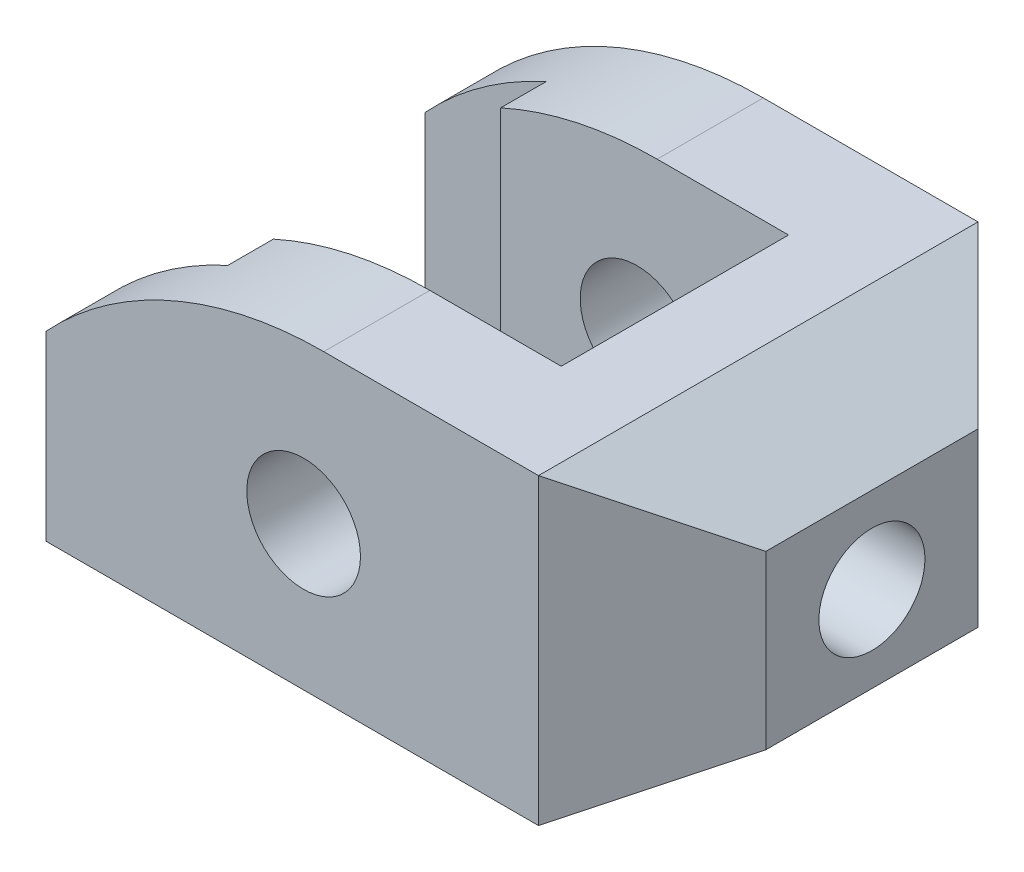
ISO-10303-21;
HEADER;
FILE_DESCRIPTION(('STEP AP214'),'2;1');
FILE_NAME('part.step','',(''),(''),'','','');
FILE_SCHEMA(('AUTOMOTIVE_DESIGN { 1 0 10303 214 1 1 1 1 }'));
ENDSEC;
DATA;
#1=APPLICATION_CONTEXT('core data for automotive mechanical design processes');
#2=APPLICATION_PROTOCOL_DEFINITION('international standard','automotive_design',2000,#1);
#3=PRODUCT_CONTEXT('',#1,'mechanical');
#4=PRODUCT('Part','Part','',(#3));
#5=PRODUCT_RELATED_PRODUCT_CATEGORY('part','',(#4));
#6=PRODUCT_DEFINITION_FORMATION('','',#4);
#7=PRODUCT_DEFINITION_CONTEXT('part definition',#1,'design');
#8=PRODUCT_DEFINITION('design','',#6,#7);
#9=PRODUCT_DEFINITION_SHAPE('','',#8);
#10=(LENGTH_UNIT() NAMED_UNIT(*) SI_UNIT(.MILLI.,.METRE.));
#11=(NAMED_UNIT(*) PLANE_ANGLE_UNIT() SI_UNIT($,.RADIAN.));
#12=(NAMED_UNIT(*) SI_UNIT($,.STERADIAN.) SOLID_ANGLE_UNIT());
#13=UNCERTAINTY_MEASURE_WITH_UNIT(LENGTH_MEASURE(1.E-05),#10,'distance_accuracy_value','');
#14=(GEOMETRIC_REPRESENTATION_CONTEXT(3) GLOBAL_UNCERTAINTY_ASSIGNED_CONTEXT((#13)) GLOBAL_UNIT_ASSIGNED_CONTEXT((#10,
#11,#12)) REPRESENTATION_CONTEXT('',''));
#15=CARTESIAN_POINT('',(0.,0.,0.));
#16=DIRECTION('',(0.,0.,1.));
#17=DIRECTION('',(1.,0.,0.));
#18=AXIS2_PLACEMENT_3D('',#15,#16,#17);
#19=CARTESIAN_POINT('',(-40.,40.,29.));
#20=DIRECTION('',(1.,0.,0.));
#21=DIRECTION('',(0.,0.,-1.));
#22=AXIS2_PLACEMENT_3D('',#19,#20,#21);
#23=PLANE('',#22);
#24=DIRECTION('',(0.,-1.,0.));
#25=VECTOR('',#24,1.);
#26=CARTESIAN_POINT('',(-40.,40.,-21.));
#27=LINE('',#26,#25);
#28=CARTESIAN_POINT('',(-40.,24.,-21.));
#29=VERTEX_POINT('',#28);
#30=CARTESIAN_POINT('',(-40.,0.,-21.));
#31=VERTEX_POINT('',#30);
#32=EDGE_CURVE('E383',#29,#31,#27,.T.);
#33=ORIENTED_EDGE('',*,*,#32,.F.);
#34=DIRECTION('',(0.,0.,1.));
#35=VECTOR('',#34,1.);
#36=CARTESIAN_POINT('',(-40.,24.,-29.));
#37=LINE('',#36,#35);
#38=CARTESIAN_POINT('',(-40.,24.,-29.));
#39=VERTEX_POINT('',#38);
#40=EDGE_CURVE('E356',#39,#29,#37,.T.);
#41=ORIENTED_EDGE('',*,*,#40,.F.);
#42=DIRECTION('',(0.,-1.,0.));
#43=VECTOR('',#42,1.);
#44=CARTESIAN_POINT('',(-40.,40.,-29.));
#45=LINE('',#44,#43);
#46=CARTESIAN_POINT('',(-40.,0.,-29.));
#47=VERTEX_POINT('',#46);
#48=EDGE_CURVE('E222',#39,#47,#45,.T.);
#49=ORIENTED_EDGE('',*,*,#48,.T.);
#50=DIRECTION('',(0.,0.,1.));
#51=VECTOR('',#50,1.);
#52=CARTESIAN_POINT('',(-40.,0.,29.));
#53=LINE('',#52,#51);
#54=EDGE_CURVE('E211',#47,#31,#53,.T.);
#55=ORIENTED_EDGE('',*,*,#54,.T.);
#56=EDGE_LOOP('',(#33,#41,#49,#55));
#57=FACE_BOUND('',#56,.T.);
#58=ADVANCED_FACE('F54',(#57),#23,.F.);
#59=DIRECTION('',(0.,-1.,0.));
#60=VECTOR('',#59,1.);
#61=CARTESIAN_POINT('',(-40.,40.,21.));
#62=LINE('',#61,#60);
#63=CARTESIAN_POINT('',(-40.,24.,21.));
#64=VERTEX_POINT('',#63);
#65=CARTESIAN_POINT('',(-40.,0.,21.));
#66=VERTEX_POINT('',#65);
#67=EDGE_CURVE('E282',#64,#66,#62,.T.);
#68=ORIENTED_EDGE('',*,*,#67,.T.);
#69=CARTESIAN_POINT('',(-40.,0.,29.));
#70=VERTEX_POINT('',#69);
#71=EDGE_CURVE('E218',#66,#70,#53,.T.);
#72=ORIENTED_EDGE('',*,*,#71,.T.);
#73=DIRECTION('',(0.,-1.,0.));
#74=VECTOR('',#73,1.);
#75=CARTESIAN_POINT('',(-40.,40.,29.));
#76=LINE('',#75,#74);
#77=CARTESIAN_POINT('',(-40.,24.,29.));
#78=VERTEX_POINT('',#77);
#79=EDGE_CURVE('E209',#78,#70,#76,.T.);
#80=ORIENTED_EDGE('',*,*,#79,.F.);
#81=EDGE_CURVE('E360',#64,#78,#37,.T.);
#82=ORIENTED_EDGE('',*,*,#81,.F.);
#83=EDGE_LOOP('',(#68,#72,#80,#82));
#84=FACE_BOUND('',#83,.T.);
#85=ADVANCED_FACE('F418',(#84),#23,.F.);
#86=CARTESIAN_POINT('',(40.,40.,29.));
#87=DIRECTION('',(0.,0.,-1.));
#88=DIRECTION('',(-1.,0.,0.));
#89=AXIS2_PLACEMENT_3D('',#86,#87,#88);
#90=PLANE('',#89);
#91=CARTESIAN_POINT('',(-6.00000000000001,19.,29.));
#92=DIRECTION('',(0.,0.,1.));
#93=DIRECTION('',(1.,0.,0.));
#94=AXIS2_PLACEMENT_3D('',#91,#92,#93);
#95=CIRCLE('',#94,7.5);
#96=CARTESIAN_POINT('',(1.49999999999999,19.,29.));
#97=VERTEX_POINT('',#96);
#98=EDGE_CURVE('E190',#97,#97,#95,.T.);
#99=ORIENTED_EDGE('',*,*,#98,.F.);
#100=EDGE_LOOP('',(#99));
#101=FACE_BOUND('',#100,.T.);
#102=DIRECTION('',(0.,-1.,0.));
#103=VECTOR('',#102,1.);
#104=CARTESIAN_POINT('',(25.,40.,29.));
#105=LINE('',#104,#103);
#106=CARTESIAN_POINT('',(25.,40.,29.));
#107=VERTEX_POINT('',#106);
#108=CARTESIAN_POINT('',(25.,0.,29.));
#109=VERTEX_POINT('',#108);
#110=EDGE_CURVE('E167',#107,#109,#105,.T.);
#111=ORIENTED_EDGE('',*,*,#110,.F.);
#112=DIRECTION('',(1.,0.,0.));
#113=VECTOR('',#112,1.);
#114=CARTESIAN_POINT('',(40.,40.,29.));
#115=LINE('',#114,#113);
#116=CARTESIAN_POINT('',(-3.33939444035328,40.,29.));
#117=VERTEX_POINT('',#116);
#118=EDGE_CURVE('E215',#117,#107,#115,.T.);
#119=ORIENTED_EDGE('',*,*,#118,.F.);
#120=CARTESIAN_POINT('',(-3.33939444035329,-10.,29.));
#121=DIRECTION('',(0.,0.,1.));
#122=DIRECTION('',(1.,0.,0.));
#123=AXIS2_PLACEMENT_3D('',#120,#121,#122);
#124=CIRCLE('',#123,50.);
#125=EDGE_CURVE('E337',#117,#78,#124,.T.);
#126=ORIENTED_EDGE('',*,*,#125,.T.);
#127=ORIENTED_EDGE('',*,*,#79,.T.);
#128=DIRECTION('',(1.,0.,0.));
#129=VECTOR('',#128,1.);
#130=CARTESIAN_POINT('',(40.,0.,29.));
#131=LINE('',#130,#129);
#132=EDGE_CURVE('E198',#70,#109,#131,.T.);
#133=ORIENTED_EDGE('',*,*,#132,.T.);
#134=EDGE_LOOP('',(#111,#119,#126,#127,#133));
#135=FACE_BOUND('',#134,.T.);
#136=ADVANCED_FACE('F206',(#101,#135),#90,.F.);
#137=CARTESIAN_POINT('',(40.,40.,29.));
#138=DIRECTION('',(-1.,0.,0.));
#139=DIRECTION('',(0.,0.,1.));
#140=AXIS2_PLACEMENT_3D('',#137,#138,#139);
#141=PLANE('',#140);
#142=CARTESIAN_POINT('',(40.,20.,0.));
#143=DIRECTION('',(1.,0.,0.));
#144=DIRECTION('',(0.,0.,-1.));
#145=AXIS2_PLACEMENT_3D('',#142,#143,#144);
#146=CIRCLE('',#145,7.);
#147=CARTESIAN_POINT('',(40.,20.,-7.));
#148=VERTEX_POINT('',#147);
#149=EDGE_CURVE('E396',#148,#148,#146,.T.);
#150=ORIENTED_EDGE('',*,*,#149,.F.);
#151=EDGE_LOOP('',(#150));
#152=FACE_BOUND('',#151,.T.);
#153=DIRECTION('',(0.,-1.,0.));
#154=VECTOR('',#153,1.);
#155=CARTESIAN_POINT('',(40.,40.,14.0000000000001));
#156=LINE('',#155,#154);
#157=CARTESIAN_POINT('',(40.,31.3397459621557,14.0000000000002));
#158=VERTEX_POINT('',#157);
#159=CARTESIAN_POINT('',(40.,8.66025403784426,14.0000000000001));
#160=VERTEX_POINT('',#159);
#161=EDGE_CURVE('E78',#158,#160,#156,.T.);
#162=ORIENTED_EDGE('',*,*,#161,.T.);
#163=DIRECTION('',(0.,0.,1.));
#164=VECTOR('',#163,1.);
#165=CARTESIAN_POINT('',(40.,8.66025403784426,-29.));
#166=LINE('',#165,#164);
#167=CARTESIAN_POINT('',(40.,8.66025403784425,-14.0000000000002));
#168=VERTEX_POINT('',#167);
#169=EDGE_CURVE('E188',#168,#160,#166,.T.);
#170=ORIENTED_EDGE('',*,*,#169,.F.);
#171=DIRECTION('',(0.,-1.,0.));
#172=VECTOR('',#171,1.);
#173=CARTESIAN_POINT('',(40.,40.,-14.0000000000002));
#174=LINE('',#173,#172);
#175=CARTESIAN_POINT('',(40.,31.3397459621557,-14.0000000000002));
#176=VERTEX_POINT('',#175);
#177=EDGE_CURVE('E234',#176,#168,#174,.T.);
#178=ORIENTED_EDGE('',*,*,#177,.F.);
#179=DIRECTION('',(0.,0.,1.));
#180=VECTOR('',#179,1.);
#181=CARTESIAN_POINT('',(40.,31.3397459621557,-29.));
#182=LINE('',#181,#180);
#183=EDGE_CURVE('E203',#176,#158,#182,.T.);
#184=ORIENTED_EDGE('',*,*,#183,.T.);
#185=EDGE_LOOP('',(#162,#170,#178,#184));
#186=FACE_BOUND('',#185,.T.);
#187=ADVANCED_FACE('F446',(#152,#186),#141,.F.);
#188=CARTESIAN_POINT('',(40.,40.,-29.));
#189=DIRECTION('',(0.,0.,1.));
#190=DIRECTION('',(1.,0.,0.));
#191=AXIS2_PLACEMENT_3D('',#188,#189,#190);
#192=PLANE('',#191);
#193=CARTESIAN_POINT('',(-6.00000000000001,19.,-29.));
#194=DIRECTION('',(0.,0.,1.));
#195=DIRECTION('',(1.,0.,0.));
#196=AXIS2_PLACEMENT_3D('',#193,#194,#195);
#197=CIRCLE('',#196,7.5);
#198=CARTESIAN_POINT('',(1.49999999999999,19.,-29.));
#199=VERTEX_POINT('',#198);
#200=EDGE_CURVE('E343',#199,#199,#197,.T.);
#201=ORIENTED_EDGE('',*,*,#200,.T.);
#202=EDGE_LOOP('',(#201));
#203=FACE_BOUND('',#202,.T.);
#204=DIRECTION('',(0.,-1.,0.));
#205=VECTOR('',#204,1.);
#206=CARTESIAN_POINT('',(25.,40.,-29.));
#207=LINE('',#206,#205);
#208=CARTESIAN_POINT('',(25.,40.,-29.));
#209=VERTEX_POINT('',#208);
#210=CARTESIAN_POINT('',(25.,0.,-29.));
#211=VERTEX_POINT('',#210);
#212=EDGE_CURVE('E177',#209,#211,#207,.T.);
#213=ORIENTED_EDGE('',*,*,#212,.T.);
#214=DIRECTION('',(-1.,0.,0.));
#215=VECTOR('',#214,1.);
#216=CARTESIAN_POINT('',(40.,0.,-29.));
#217=LINE('',#216,#215);
#218=EDGE_CURVE('E201',#211,#47,#217,.T.);
#219=ORIENTED_EDGE('',*,*,#218,.T.);
#220=ORIENTED_EDGE('',*,*,#48,.F.);
#221=CARTESIAN_POINT('',(-3.33939444035329,-10.,-29.));
#222=DIRECTION('',(0.,0.,1.));
#223=DIRECTION('',(1.,0.,0.));
#224=AXIS2_PLACEMENT_3D('',#221,#222,#223);
#225=CIRCLE('',#224,50.);
#226=CARTESIAN_POINT('',(-3.33939444035329,40.,-29.));
#227=VERTEX_POINT('',#226);
#228=EDGE_CURVE('E350',#227,#39,#225,.T.);
#229=ORIENTED_EDGE('',*,*,#228,.F.);
#230=DIRECTION('',(-1.,0.,0.));
#231=VECTOR('',#230,1.);
#232=CARTESIAN_POINT('',(40.,40.,-29.));
#233=LINE('',#232,#231);
#234=EDGE_CURVE('E225',#209,#227,#233,.T.);
#235=ORIENTED_EDGE('',*,*,#234,.F.);
#236=EDGE_LOOP('',(#213,#219,#220,#229,#235));
#237=FACE_BOUND('',#236,.T.);
#238=ADVANCED_FACE('F376',(#203,#237),#192,.F.);
#239=CARTESIAN_POINT('',(0.,40.,0.));
#240=DIRECTION('',(0.,1.,0.));
#241=DIRECTION('',(0.,0.,1.));
#242=AXIS2_PLACEMENT_3D('',#239,#240,#241);
#243=PLANE('',#242);
#244=DIRECTION('',(0.,0.,-1.));
#245=VECTOR('',#244,1.);
#246=CARTESIAN_POINT('',(14.,40.,-15.));
#247=LINE('',#246,#245);
#248=CARTESIAN_POINT('',(14.,40.,15.));
#249=VERTEX_POINT('',#248);
#250=CARTESIAN_POINT('',(14.,40.,-15.));
#251=VERTEX_POINT('',#250);
#252=EDGE_CURVE('E318',#249,#251,#247,.T.);
#253=ORIENTED_EDGE('',*,*,#252,.F.);
#254=DIRECTION('',(1.,0.,0.));
#255=VECTOR('',#254,1.);
#256=CARTESIAN_POINT('',(-24.,40.,15.));
#257=LINE('',#256,#255);
#258=CARTESIAN_POINT('',(-3.33939444035329,40.,15.));
#259=VERTEX_POINT('',#258);
#260=EDGE_CURVE('E296',#259,#249,#257,.T.);
#261=ORIENTED_EDGE('',*,*,#260,.F.);
#262=DIRECTION('',(0.,0.,1.));
#263=VECTOR('',#262,1.);
#264=CARTESIAN_POINT('',(-3.33939444035329,40.,-29.));
#265=LINE('',#264,#263);
#266=EDGE_CURVE('E353',#259,#117,#265,.T.);
#267=ORIENTED_EDGE('',*,*,#266,.T.);
#268=ORIENTED_EDGE('',*,*,#118,.T.);
#269=DIRECTION('',(0.,0.,1.));
#270=VECTOR('',#269,1.);
#271=CARTESIAN_POINT('',(25.,40.,-29.));
#272=LINE('',#271,#270);
#273=EDGE_CURVE('E334',#209,#107,#272,.T.);
#274=ORIENTED_EDGE('',*,*,#273,.F.);
#275=ORIENTED_EDGE('',*,*,#234,.T.);
#276=CARTESIAN_POINT('',(-3.33939444035329,40.,-15.));
#277=VERTEX_POINT('',#276);
#278=EDGE_CURVE('E361',#227,#277,#265,.T.);
#279=ORIENTED_EDGE('',*,*,#278,.T.);
#280=DIRECTION('',(-1.,0.,0.));
#281=VECTOR('',#280,1.);
#282=CARTESIAN_POINT('',(-24.,40.,-15.));
#283=LINE('',#282,#281);
#284=EDGE_CURVE('E70',#251,#277,#283,.T.);
#285=ORIENTED_EDGE('',*,*,#284,.F.);
#286=EDGE_LOOP('',(#253,#261,#267,#268,#274,#275,#279,#285));
#287=FACE_BOUND('',#286,.T.);
#288=ADVANCED_FACE('F373',(#287),#243,.T.);
#289=CARTESIAN_POINT('',(0.,0.,0.));
#290=DIRECTION('',(0.,1.,0.));
#291=DIRECTION('',(0.,0.,1.));
#292=AXIS2_PLACEMENT_3D('',#289,#290,#291);
#293=PLANE('',#292);
#294=DIRECTION('',(-1.,0.,0.));
#295=VECTOR('',#294,1.);
#296=CARTESIAN_POINT('',(-40.,0.,-21.));
#297=LINE('',#296,#295);
#298=CARTESIAN_POINT('',(-24.,0.,-21.));
#299=VERTEX_POINT('',#298);
#300=EDGE_CURVE('E309',#299,#31,#297,.T.);
#301=ORIENTED_EDGE('',*,*,#300,.T.);
#302=ORIENTED_EDGE('',*,*,#54,.F.);
#303=ORIENTED_EDGE('',*,*,#218,.F.);
#304=DIRECTION('',(0.,0.,1.));
#305=VECTOR('',#304,1.);
#306=CARTESIAN_POINT('',(25.,0.,-29.));
#307=LINE('',#306,#305);
#308=EDGE_CURVE('E185',#211,#109,#307,.T.);
#309=ORIENTED_EDGE('',*,*,#308,.T.);
#310=ORIENTED_EDGE('',*,*,#132,.F.);
#311=ORIENTED_EDGE('',*,*,#71,.F.);
#312=DIRECTION('',(1.,0.,0.));
#313=VECTOR('',#312,1.);
#314=CARTESIAN_POINT('',(-40.,0.,21.));
#315=LINE('',#314,#313);
#316=CARTESIAN_POINT('',(-24.,0.,21.));
#317=VERTEX_POINT('',#316);
#318=EDGE_CURVE('E305',#66,#317,#315,.T.);
#319=ORIENTED_EDGE('',*,*,#318,.T.);
#320=DIRECTION('',(0.,0.,-1.));
#321=VECTOR('',#320,1.);
#322=CARTESIAN_POINT('',(-24.,0.,21.));
#323=LINE('',#322,#321);
#324=CARTESIAN_POINT('',(-24.,0.,15.));
#325=VERTEX_POINT('',#324);
#326=EDGE_CURVE('E302',#317,#325,#323,.T.);
#327=ORIENTED_EDGE('',*,*,#326,.T.);
#328=DIRECTION('',(1.,0.,0.));
#329=VECTOR('',#328,1.);
#330=CARTESIAN_POINT('',(-24.,0.,15.));
#331=LINE('',#330,#329);
#332=CARTESIAN_POINT('',(14.,0.,15.));
#333=VERTEX_POINT('',#332);
#334=EDGE_CURVE('E273',#325,#333,#331,.T.);
#335=ORIENTED_EDGE('',*,*,#334,.T.);
#336=DIRECTION('',(0.,0.,-1.));
#337=VECTOR('',#336,1.);
#338=CARTESIAN_POINT('',(14.,0.,-15.));
#339=LINE('',#338,#337);
#340=CARTESIAN_POINT('',(14.,0.,-15.));
#341=VERTEX_POINT('',#340);
#342=EDGE_CURVE('E295',#333,#341,#339,.T.);
#343=ORIENTED_EDGE('',*,*,#342,.T.);
#344=DIRECTION('',(-1.,0.,0.));
#345=VECTOR('',#344,1.);
#346=CARTESIAN_POINT('',(-24.,0.,-15.));
#347=LINE('',#346,#345);
#348=CARTESIAN_POINT('',(-24.,0.,-15.));
#349=VERTEX_POINT('',#348);
#350=EDGE_CURVE('E291',#341,#349,#347,.T.);
#351=ORIENTED_EDGE('',*,*,#350,.T.);
#352=DIRECTION('',(0.,0.,-1.));
#353=VECTOR('',#352,1.);
#354=CARTESIAN_POINT('',(-24.,0.,-21.));
#355=LINE('',#354,#353);
#356=EDGE_CURVE('E312',#349,#299,#355,.T.);
#357=ORIENTED_EDGE('',*,*,#356,.T.);
#358=EDGE_LOOP('',(#301,#302,#303,#309,#310,#311,#319,#327,#335,#343,#351,#357));
#359=FACE_BOUND('',#358,.T.);
#360=ADVANCED_FACE('F196',(#359),#293,.F.);
#361=CARTESIAN_POINT('',(6.24999999999986,-10.8253175473054,-29.));
#362=DIRECTION('',(-0.499999999999995,0.866025403784442,0.));
#363=DIRECTION('',(-0.866025403784442,-0.499999999999994,0.));
#364=AXIS2_PLACEMENT_3D('',#361,#362,#363);
#365=PLANE('',#364);
#366=DIRECTION('',(0.654653670707981,0.377964473009224,-0.654653670707975));
#367=VECTOR('',#366,1.);
#368=CARTESIAN_POINT('',(39.1428571428571,8.16538237853884,14.8571428571431));
#369=LINE('',#368,#367);
#370=EDGE_CURVE('E170',#109,#160,#369,.T.);
#371=ORIENTED_EDGE('',*,*,#370,.F.);
#372=ORIENTED_EDGE('',*,*,#308,.F.);
#373=DIRECTION('',(-0.654653670707982,-0.377964473009224,-0.654653670707974));
#374=VECTOR('',#373,1.);
#375=CARTESIAN_POINT('',(14.2857142857141,-6.18589574131741,-39.7142857142857));
#376=LINE('',#375,#374);
#377=EDGE_CURVE('E191',#168,#211,#376,.T.);
#378=ORIENTED_EDGE('',*,*,#377,.F.);
#379=ORIENTED_EDGE('',*,*,#169,.T.);
#380=EDGE_LOOP('',(#371,#372,#378,#379));
#381=FACE_BOUND('',#380,.T.);
#382=ADVANCED_FACE('F183',(#381),#365,.F.);
#383=CARTESIAN_POINT('',(-3.33939444035329,-10.,-29.));
#384=DIRECTION('',(0.,0.,1.));
#385=DIRECTION('',(1.,0.,0.));
#386=AXIS2_PLACEMENT_3D('',#383,#384,#385);
#387=CYLINDRICAL_SURFACE('',#386,50.);
#388=DIRECTION('',(0.,0.,1.));
#389=VECTOR('',#388,1.);
#390=CARTESIAN_POINT('',(-24.,35.5317403347236,-29.));
#391=LINE('',#390,#389);
#392=CARTESIAN_POINT('',(-24.,35.5317403347236,15.));
#393=VERTEX_POINT('',#392);
#394=CARTESIAN_POINT('',(-24.,35.5317403347236,21.));
#395=VERTEX_POINT('',#394);
#396=EDGE_CURVE('E63',#393,#395,#391,.T.);
#397=ORIENTED_EDGE('',*,*,#396,.T.);
#398=CARTESIAN_POINT('',(-3.33939444035329,-10.,21.));
#399=DIRECTION('',(0.,0.,-1.));
#400=DIRECTION('',(-1.,0.,0.));
#401=AXIS2_PLACEMENT_3D('',#398,#399,#400);
#402=CIRCLE('',#401,50.);
#403=EDGE_CURVE('E12',#395,#64,#402,.F.);
#404=ORIENTED_EDGE('',*,*,#403,.T.);
#405=ORIENTED_EDGE('',*,*,#81,.T.);
#406=ORIENTED_EDGE('',*,*,#125,.F.);
#407=ORIENTED_EDGE('',*,*,#266,.F.);
#408=CARTESIAN_POINT('',(-3.33939444035329,-10.,15.));
#409=DIRECTION('',(0.,0.,-1.));
#410=DIRECTION('',(-1.,0.,0.));
#411=AXIS2_PLACEMENT_3D('',#408,#409,#410);
#412=CIRCLE('',#411,50.);
#413=EDGE_CURVE('E239',#259,#393,#412,.F.);
#414=ORIENTED_EDGE('',*,*,#413,.T.);
#415=EDGE_LOOP('',(#397,#404,#405,#406,#407,#414));
#416=FACE_BOUND('',#415,.T.);
#417=ADVANCED_FACE('F257',(#416),#387,.T.);
#418=ORIENTED_EDGE('',*,*,#40,.T.);
#419=CARTESIAN_POINT('',(-3.33939444035329,-10.,-21.));
#420=DIRECTION('',(0.,0.,1.));
#421=DIRECTION('',(1.,0.,0.));
#422=AXIS2_PLACEMENT_3D('',#419,#420,#421);
#423=CIRCLE('',#422,50.);
#424=CARTESIAN_POINT('',(-24.,35.5317403347236,-21.));
#425=VERTEX_POINT('',#424);
#426=EDGE_CURVE('E249',#29,#425,#423,.F.);
#427=ORIENTED_EDGE('',*,*,#426,.T.);
#428=DIRECTION('',(0.,0.,1.));
#429=VECTOR('',#428,1.);
#430=CARTESIAN_POINT('',(-24.,35.5317403347236,-29.));
#431=LINE('',#430,#429);
#432=CARTESIAN_POINT('',(-24.,35.5317403347236,-15.));
#433=VERTEX_POINT('',#432);
#434=EDGE_CURVE('E245',#425,#433,#431,.T.);
#435=ORIENTED_EDGE('',*,*,#434,.T.);
#436=CARTESIAN_POINT('',(-3.33939444035329,-10.,-15.));
#437=DIRECTION('',(0.,0.,1.));
#438=DIRECTION('',(1.,0.,0.));
#439=AXIS2_PLACEMENT_3D('',#436,#437,#438);
#440=CIRCLE('',#439,50.);
#441=EDGE_CURVE('E233',#433,#277,#440,.F.);
#442=ORIENTED_EDGE('',*,*,#441,.T.);
#443=ORIENTED_EDGE('',*,*,#278,.F.);
#444=ORIENTED_EDGE('',*,*,#228,.T.);
#445=EDGE_LOOP('',(#418,#427,#435,#442,#443,#444));
#446=FACE_BOUND('',#445,.T.);
#447=ADVANCED_FACE('F380',(#446),#387,.T.);
#448=CARTESIAN_POINT('',(23.5705080756885,40.8253175473056,-29.));
#449=DIRECTION('',(0.499999999999995,0.866025403784442,0.));
#450=DIRECTION('',(-0.866025403784442,0.499999999999995,0.));
#451=AXIS2_PLACEMENT_3D('',#448,#449,#450);
#452=PLANE('',#451);
#453=ORIENTED_EDGE('',*,*,#273,.T.);
#454=DIRECTION('',(0.654653670707981,-0.377964473009224,-0.654653670707975));
#455=VECTOR('',#454,1.);
#456=CARTESIAN_POINT('',(49.0402903289649,26.1203319071755,4.95970967103531));
#457=LINE('',#456,#455);
#458=EDGE_CURVE('E171',#107,#158,#457,.T.);
#459=ORIENTED_EDGE('',*,*,#458,.T.);
#460=ORIENTED_EDGE('',*,*,#183,.F.);
#461=DIRECTION('',(-0.654653670707981,0.377964473009225,-0.654653670707974));
#462=VECTOR('',#461,1.);
#463=CARTESIAN_POINT('',(24.183147471822,40.4716100270318,-29.816852528178));
#464=LINE('',#463,#462);
#465=EDGE_CURVE('E228',#176,#209,#464,.T.);
#466=ORIENTED_EDGE('',*,*,#465,.T.);
#467=EDGE_LOOP('',(#453,#459,#460,#466));
#468=FACE_BOUND('',#467,.T.);
#469=ADVANCED_FACE('F468',(#468),#452,.T.);
#470=CARTESIAN_POINT('',(-6.00000000000001,19.,-29.));
#471=DIRECTION('',(0.,0.,1.));
#472=DIRECTION('',(1.,0.,0.));
#473=AXIS2_PLACEMENT_3D('',#470,#471,#472);
#474=CYLINDRICAL_SURFACE('',#473,7.5);
#475=ORIENTED_EDGE('',*,*,#98,.T.);
#476=EDGE_LOOP('',(#475));
#477=FACE_BOUND('',#476,.T.);
#478=CARTESIAN_POINT('',(-6.00000000000001,19.,15.));
#479=DIRECTION('',(0.,0.,-1.));
#480=DIRECTION('',(-1.,0.,0.));
#481=AXIS2_PLACEMENT_3D('',#478,#479,#480);
#482=CIRCLE('',#481,7.5);
#483=CARTESIAN_POINT('',(-13.5,19.,15.));
#484=VERTEX_POINT('',#483);
#485=EDGE_CURVE('E235',#484,#484,#482,.F.);
#486=ORIENTED_EDGE('',*,*,#485,.F.);
#487=EDGE_LOOP('',(#486));
#488=FACE_BOUND('',#487,.T.);
#489=ADVANCED_FACE('F464',(#477,#488),#474,.F.);
#490=ORIENTED_EDGE('',*,*,#200,.F.);
#491=EDGE_LOOP('',(#490));
#492=FACE_BOUND('',#491,.T.);
#493=CARTESIAN_POINT('',(-6.00000000000001,19.,-15.));
#494=DIRECTION('',(0.,0.,1.));
#495=DIRECTION('',(1.,0.,0.));
#496=AXIS2_PLACEMENT_3D('',#493,#494,#495);
#497=CIRCLE('',#496,7.5);
#498=CARTESIAN_POINT('',(1.49999999999999,19.,-15.));
#499=VERTEX_POINT('',#498);
#500=EDGE_CURVE('E229',#499,#499,#497,.F.);
#501=ORIENTED_EDGE('',*,*,#500,.F.);
#502=EDGE_LOOP('',(#501));
#503=FACE_BOUND('',#502,.T.);
#504=ADVANCED_FACE('F467',(#492,#503),#474,.F.);
#505=CARTESIAN_POINT('',(-24.,40.,15.));
#506=DIRECTION('',(0.,0.,-1.));
#507=DIRECTION('',(-1.,0.,0.));
#508=AXIS2_PLACEMENT_3D('',#505,#506,#507);
#509=PLANE('',#508);
#510=ORIENTED_EDGE('',*,*,#260,.T.);
#511=DIRECTION('',(0.,-1.,0.));
#512=VECTOR('',#511,1.);
#513=CARTESIAN_POINT('',(14.,40.,15.));
#514=LINE('',#513,#512);
#515=EDGE_CURVE('E276',#249,#333,#514,.T.);
#516=ORIENTED_EDGE('',*,*,#515,.T.);
#517=ORIENTED_EDGE('',*,*,#334,.F.);
#518=DIRECTION('',(0.,-1.,0.));
#519=VECTOR('',#518,1.);
#520=CARTESIAN_POINT('',(-24.,40.,15.));
#521=LINE('',#520,#519);
#522=EDGE_CURVE('E265',#393,#325,#521,.T.);
#523=ORIENTED_EDGE('',*,*,#522,.F.);
#524=ORIENTED_EDGE('',*,*,#413,.F.);
#525=EDGE_LOOP('',(#510,#516,#517,#523,#524));
#526=FACE_BOUND('',#525,.T.);
#527=ORIENTED_EDGE('',*,*,#485,.T.);
#528=EDGE_LOOP('',(#527));
#529=FACE_BOUND('',#528,.T.);
#530=ADVANCED_FACE('F269',(#526,#529),#509,.T.);
#531=CARTESIAN_POINT('',(-24.,40.,-15.));
#532=DIRECTION('',(0.,0.,1.));
#533=DIRECTION('',(1.,0.,0.));
#534=AXIS2_PLACEMENT_3D('',#531,#532,#533);
#535=PLANE('',#534);
#536=DIRECTION('',(0.,-1.,0.));
#537=VECTOR('',#536,1.);
#538=CARTESIAN_POINT('',(-24.,40.,-15.));
#539=LINE('',#538,#537);
#540=EDGE_CURVE('E288',#433,#349,#539,.T.);
#541=ORIENTED_EDGE('',*,*,#540,.T.);
#542=ORIENTED_EDGE('',*,*,#350,.F.);
#543=DIRECTION('',(0.,-1.,0.));
#544=VECTOR('',#543,1.);
#545=CARTESIAN_POINT('',(14.,40.,-15.));
#546=LINE('',#545,#544);
#547=EDGE_CURVE('E280',#251,#341,#546,.T.);
#548=ORIENTED_EDGE('',*,*,#547,.F.);
#549=ORIENTED_EDGE('',*,*,#284,.T.);
#550=ORIENTED_EDGE('',*,*,#441,.F.);
#551=EDGE_LOOP('',(#541,#542,#548,#549,#550));
#552=FACE_BOUND('',#551,.T.);
#553=ORIENTED_EDGE('',*,*,#500,.T.);
#554=EDGE_LOOP('',(#553));
#555=FACE_BOUND('',#554,.T.);
#556=ADVANCED_FACE('F423',(#552,#555),#535,.T.);
#557=CARTESIAN_POINT('',(-24.,40.,-21.));
#558=DIRECTION('',(-1.,0.,0.));
#559=DIRECTION('',(0.,0.,1.));
#560=AXIS2_PLACEMENT_3D('',#557,#558,#559);
#561=PLANE('',#560);
#562=DIRECTION('',(0.,-1.,0.));
#563=VECTOR('',#562,1.);
#564=CARTESIAN_POINT('',(-24.,40.,-21.));
#565=LINE('',#564,#563);
#566=EDGE_CURVE('E387',#425,#299,#565,.T.);
#567=ORIENTED_EDGE('',*,*,#566,.T.);
#568=ORIENTED_EDGE('',*,*,#356,.F.);
#569=ORIENTED_EDGE('',*,*,#540,.F.);
#570=ORIENTED_EDGE('',*,*,#434,.F.);
#571=EDGE_LOOP('',(#567,#568,#569,#570));
#572=FACE_BOUND('',#571,.T.);
#573=ADVANCED_FACE('F428',(#572),#561,.T.);
#574=CARTESIAN_POINT('',(-40.,40.,-21.));
#575=DIRECTION('',(0.,0.,1.));
#576=DIRECTION('',(1.,0.,0.));
#577=AXIS2_PLACEMENT_3D('',#574,#575,#576);
#578=PLANE('',#577);
#579=ORIENTED_EDGE('',*,*,#32,.T.);
#580=ORIENTED_EDGE('',*,*,#300,.F.);
#581=ORIENTED_EDGE('',*,*,#566,.F.);
#582=ORIENTED_EDGE('',*,*,#426,.F.);
#583=EDGE_LOOP('',(#579,#580,#581,#582));
#584=FACE_BOUND('',#583,.T.);
#585=ADVANCED_FACE('F430',(#584),#578,.T.);
#586=CARTESIAN_POINT('',(-40.,40.,21.));
#587=DIRECTION('',(0.,0.,-1.));
#588=DIRECTION('',(-1.,0.,0.));
#589=AXIS2_PLACEMENT_3D('',#586,#587,#588);
#590=PLANE('',#589);
#591=DIRECTION('',(0.,-1.,0.));
#592=VECTOR('',#591,1.);
#593=CARTESIAN_POINT('',(-24.,40.,21.));
#594=LINE('',#593,#592);
#595=EDGE_CURVE('E267',#395,#317,#594,.T.);
#596=ORIENTED_EDGE('',*,*,#595,.T.);
#597=ORIENTED_EDGE('',*,*,#318,.F.);
#598=ORIENTED_EDGE('',*,*,#67,.F.);
#599=ORIENTED_EDGE('',*,*,#403,.F.);
#600=EDGE_LOOP('',(#596,#597,#598,#599));
#601=FACE_BOUND('',#600,.T.);
#602=ADVANCED_FACE('F416',(#601),#590,.T.);
#603=CARTESIAN_POINT('',(-24.,40.,21.));
#604=DIRECTION('',(-1.,0.,0.));
#605=DIRECTION('',(0.,0.,1.));
#606=AXIS2_PLACEMENT_3D('',#603,#604,#605);
#607=PLANE('',#606);
#608=ORIENTED_EDGE('',*,*,#522,.T.);
#609=ORIENTED_EDGE('',*,*,#326,.F.);
#610=ORIENTED_EDGE('',*,*,#595,.F.);
#611=ORIENTED_EDGE('',*,*,#396,.F.);
#612=EDGE_LOOP('',(#608,#609,#610,#611));
#613=FACE_BOUND('',#612,.T.);
#614=ADVANCED_FACE('F263',(#613),#607,.T.);
#615=CARTESIAN_POINT('',(14.,40.,-15.));
#616=DIRECTION('',(-1.,0.,0.));
#617=DIRECTION('',(0.,0.,1.));
#618=AXIS2_PLACEMENT_3D('',#615,#616,#617);
#619=PLANE('',#618);
#620=CARTESIAN_POINT('',(14.,20.,0.));
#621=DIRECTION('',(-1.,0.,0.));
#622=DIRECTION('',(0.,0.,1.));
#623=AXIS2_PLACEMENT_3D('',#620,#621,#622);
#624=CIRCLE('',#623,7.);
#625=CARTESIAN_POINT('',(14.,20.,6.99999999999999));
#626=VERTEX_POINT('',#625);
#627=EDGE_CURVE('E57',#626,#626,#624,.T.);
#628=ORIENTED_EDGE('',*,*,#627,.F.);
#629=EDGE_LOOP('',(#628));
#630=FACE_BOUND('',#629,.T.);
#631=ORIENTED_EDGE('',*,*,#342,.F.);
#632=ORIENTED_EDGE('',*,*,#515,.F.);
#633=ORIENTED_EDGE('',*,*,#252,.T.);
#634=ORIENTED_EDGE('',*,*,#547,.T.);
#635=EDGE_LOOP('',(#631,#632,#633,#634));
#636=FACE_BOUND('',#635,.T.);
#637=ADVANCED_FACE('F407',(#630,#636),#619,.T.);
#638=CARTESIAN_POINT('',(40.,40.,-14.0000000000002));
#639=DIRECTION('',(0.707106781186544,0.,-0.707106781186551));
#640=DIRECTION('',(-0.707106781186551,0.,-0.707106781186544));
#641=AXIS2_PLACEMENT_3D('',#638,#639,#640);
#642=PLANE('',#641);
#643=ORIENTED_EDGE('',*,*,#377,.T.);
#644=ORIENTED_EDGE('',*,*,#212,.F.);
#645=ORIENTED_EDGE('',*,*,#465,.F.);
#646=ORIENTED_EDGE('',*,*,#177,.T.);
#647=EDGE_LOOP('',(#643,#644,#645,#646));
#648=FACE_BOUND('',#647,.T.);
#649=ADVANCED_FACE('F410',(#648),#642,.T.);
#650=CARTESIAN_POINT('',(40.,40.,14.0000000000001));
#651=DIRECTION('',(0.707106781186544,0.,0.707106781186551));
#652=DIRECTION('',(0.707106781186551,0.,-0.707106781186544));
#653=AXIS2_PLACEMENT_3D('',#650,#651,#652);
#654=PLANE('',#653);
#655=ORIENTED_EDGE('',*,*,#370,.T.);
#656=ORIENTED_EDGE('',*,*,#161,.F.);
#657=ORIENTED_EDGE('',*,*,#458,.F.);
#658=ORIENTED_EDGE('',*,*,#110,.T.);
#659=EDGE_LOOP('',(#655,#656,#657,#658));
#660=FACE_BOUND('',#659,.T.);
#661=ADVANCED_FACE('F169',(#660),#654,.T.);
#662=CARTESIAN_POINT('',(-40.,20.,0.));
#663=DIRECTION('',(1.,0.,0.));
#664=DIRECTION('',(0.,0.,-1.));
#665=AXIS2_PLACEMENT_3D('',#662,#663,#664);
#666=CYLINDRICAL_SURFACE('',#665,7.);
#667=ORIENTED_EDGE('',*,*,#627,.T.);
#668=EDGE_LOOP('',(#667));
#669=FACE_BOUND('',#668,.T.);
#670=ORIENTED_EDGE('',*,*,#149,.T.);
#671=EDGE_LOOP('',(#670));
#672=FACE_BOUND('',#671,.T.);
#673=ADVANCED_FACE('F405',(#669,#672),#666,.F.);
#674=CLOSED_SHELL('',(#58,#85,#136,#187,#238,#288,#360,#382,#417,#447,#469,#489,#504,#530,#556,
#573,#585,#602,#614,#637,#649,#661,#673));
#675=MANIFOLD_SOLID_BREP('B2',#674);
#676=ADVANCED_BREP_SHAPE_REPRESENTATION('',(#18,#675),#14);
#677=SHAPE_DEFINITION_REPRESENTATION(#9,#676);
ENDSEC;
END-ISO-10303-21;
